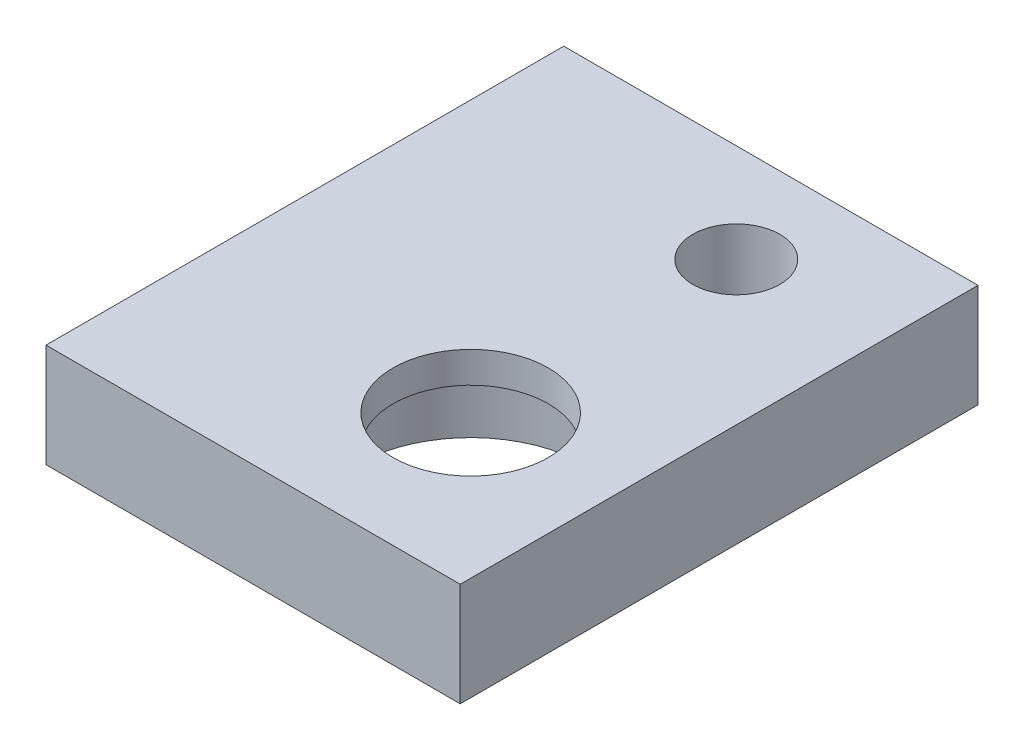
ISO-10303-21;
HEADER;
FILE_DESCRIPTION(('STEP AP214'),'2;1');
FILE_NAME('part.step','',(''),(''),'','','');
FILE_SCHEMA(('AUTOMOTIVE_DESIGN { 1 0 10303 214 1 1 1 1 }'));
ENDSEC;
DATA;
#1=APPLICATION_CONTEXT('core data for automotive mechanical design processes');
#2=APPLICATION_PROTOCOL_DEFINITION('international standard','automotive_design',2000,#1);
#3=PRODUCT_CONTEXT('',#1,'mechanical');
#4=PRODUCT('Part','Part','',(#3));
#5=PRODUCT_RELATED_PRODUCT_CATEGORY('part','',(#4));
#6=PRODUCT_DEFINITION_FORMATION('','',#4);
#7=PRODUCT_DEFINITION_CONTEXT('part definition',#1,'design');
#8=PRODUCT_DEFINITION('design','',#6,#7);
#9=PRODUCT_DEFINITION_SHAPE('','',#8);
#10=(LENGTH_UNIT() NAMED_UNIT(*) SI_UNIT(.MILLI.,.METRE.));
#11=(NAMED_UNIT(*) PLANE_ANGLE_UNIT() SI_UNIT($,.RADIAN.));
#12=(NAMED_UNIT(*) SI_UNIT($,.STERADIAN.) SOLID_ANGLE_UNIT());
#13=UNCERTAINTY_MEASURE_WITH_UNIT(LENGTH_MEASURE(1.E-05),#10,'distance_accuracy_value','');
#14=(GEOMETRIC_REPRESENTATION_CONTEXT(3) GLOBAL_UNCERTAINTY_ASSIGNED_CONTEXT((#13)) GLOBAL_UNIT_ASSIGNED_CONTEXT((#10,
#11,#12)) REPRESENTATION_CONTEXT('',''));
#15=CARTESIAN_POINT('',(0.,0.,0.));
#16=DIRECTION('',(0.,0.,1.));
#17=DIRECTION('',(1.,0.,0.));
#18=AXIS2_PLACEMENT_3D('',#15,#16,#17);
#19=CARTESIAN_POINT('',(0.,10.,0.));
#20=DIRECTION('',(0.,0.,-1.));
#21=DIRECTION('',(-1.,0.,0.));
#22=AXIS2_PLACEMENT_3D('',#19,#20,#21);
#23=PLANE('',#22);
#24=DIRECTION('',(1.,0.,0.));
#25=VECTOR('',#24,1.);
#26=CARTESIAN_POINT('',(0.,0.,0.));
#27=LINE('',#26,#25);
#28=CARTESIAN_POINT('',(0.,0.,0.));
#29=VERTEX_POINT('',#28);
#30=CARTESIAN_POINT('',(40.,0.,0.));
#31=VERTEX_POINT('',#30);
#32=EDGE_CURVE('E101',#29,#31,#27,.T.);
#33=ORIENTED_EDGE('',*,*,#32,.F.);
#34=DIRECTION('',(0.,-1.,0.));
#35=VECTOR('',#34,1.);
#36=CARTESIAN_POINT('',(0.,10.,0.));
#37=LINE('',#36,#35);
#38=CARTESIAN_POINT('',(0.,10.,0.));
#39=VERTEX_POINT('',#38);
#40=EDGE_CURVE('E11',#39,#29,#37,.T.);
#41=ORIENTED_EDGE('',*,*,#40,.F.);
#42=DIRECTION('',(1.,0.,0.));
#43=VECTOR('',#42,1.);
#44=CARTESIAN_POINT('',(0.,10.,0.));
#45=LINE('',#44,#43);
#46=CARTESIAN_POINT('',(40.,10.,0.));
#47=VERTEX_POINT('',#46);
#48=EDGE_CURVE('E95',#39,#47,#45,.T.);
#49=ORIENTED_EDGE('',*,*,#48,.T.);
#50=DIRECTION('',(0.,-1.,0.));
#51=VECTOR('',#50,1.);
#52=CARTESIAN_POINT('',(40.,10.,0.));
#53=LINE('',#52,#51);
#54=EDGE_CURVE('E74',#47,#31,#53,.T.);
#55=ORIENTED_EDGE('',*,*,#54,.T.);
#56=EDGE_LOOP('',(#33,#41,#49,#55));
#57=FACE_BOUND('',#56,.T.);
#58=ADVANCED_FACE('F33',(#57),#23,.T.);
#59=CARTESIAN_POINT('',(0.,10.,0.));
#60=DIRECTION('',(1.,0.,0.));
#61=DIRECTION('',(0.,0.,-1.));
#62=AXIS2_PLACEMENT_3D('',#59,#60,#61);
#63=PLANE('',#62);
#64=DIRECTION('',(0.,0.,1.));
#65=VECTOR('',#64,1.);
#66=CARTESIAN_POINT('',(0.,0.,0.));
#67=LINE('',#66,#65);
#68=CARTESIAN_POINT('',(0.,0.,50.));
#69=VERTEX_POINT('',#68);
#70=EDGE_CURVE('E66',#29,#69,#67,.T.);
#71=ORIENTED_EDGE('',*,*,#70,.T.);
#72=DIRECTION('',(0.,-1.,0.));
#73=VECTOR('',#72,1.);
#74=CARTESIAN_POINT('',(0.,10.,50.));
#75=LINE('',#74,#73);
#76=CARTESIAN_POINT('',(0.,10.,50.));
#77=VERTEX_POINT('',#76);
#78=EDGE_CURVE('E42',#77,#69,#75,.T.);
#79=ORIENTED_EDGE('',*,*,#78,.F.);
#80=DIRECTION('',(0.,0.,1.));
#81=VECTOR('',#80,1.);
#82=CARTESIAN_POINT('',(0.,10.,0.));
#83=LINE('',#82,#81);
#84=EDGE_CURVE('E84',#39,#77,#83,.T.);
#85=ORIENTED_EDGE('',*,*,#84,.F.);
#86=ORIENTED_EDGE('',*,*,#40,.T.);
#87=EDGE_LOOP('',(#71,#79,#85,#86));
#88=FACE_BOUND('',#87,.T.);
#89=ADVANCED_FACE('F128',(#88),#63,.F.);
#90=CARTESIAN_POINT('',(0.,10.,50.));
#91=DIRECTION('',(0.,0.,-1.));
#92=DIRECTION('',(-1.,0.,0.));
#93=AXIS2_PLACEMENT_3D('',#90,#91,#92);
#94=PLANE('',#93);
#95=DIRECTION('',(1.,0.,0.));
#96=VECTOR('',#95,1.);
#97=CARTESIAN_POINT('',(0.,0.,50.));
#98=LINE('',#97,#96);
#99=CARTESIAN_POINT('',(40.,0.,50.));
#100=VERTEX_POINT('',#99);
#101=EDGE_CURVE('E91',#69,#100,#98,.T.);
#102=ORIENTED_EDGE('',*,*,#101,.T.);
#103=DIRECTION('',(0.,-1.,0.));
#104=VECTOR('',#103,1.);
#105=CARTESIAN_POINT('',(40.,10.,50.));
#106=LINE('',#105,#104);
#107=CARTESIAN_POINT('',(40.,10.,50.));
#108=VERTEX_POINT('',#107);
#109=EDGE_CURVE('E88',#108,#100,#106,.T.);
#110=ORIENTED_EDGE('',*,*,#109,.F.);
#111=DIRECTION('',(1.,0.,0.));
#112=VECTOR('',#111,1.);
#113=CARTESIAN_POINT('',(0.,10.,50.));
#114=LINE('',#113,#112);
#115=EDGE_CURVE('E79',#77,#108,#114,.T.);
#116=ORIENTED_EDGE('',*,*,#115,.F.);
#117=ORIENTED_EDGE('',*,*,#78,.T.);
#118=EDGE_LOOP('',(#102,#110,#116,#117));
#119=FACE_BOUND('',#118,.T.);
#120=ADVANCED_FACE('F89',(#119),#94,.F.);
#121=CARTESIAN_POINT('',(40.,10.,0.));
#122=DIRECTION('',(1.,0.,0.));
#123=DIRECTION('',(0.,0.,-1.));
#124=AXIS2_PLACEMENT_3D('',#121,#122,#123);
#125=PLANE('',#124);
#126=DIRECTION('',(0.,0.,1.));
#127=VECTOR('',#126,1.);
#128=CARTESIAN_POINT('',(40.,0.,0.));
#129=LINE('',#128,#127);
#130=EDGE_CURVE('E104',#31,#100,#129,.T.);
#131=ORIENTED_EDGE('',*,*,#130,.F.);
#132=ORIENTED_EDGE('',*,*,#54,.F.);
#133=DIRECTION('',(0.,0.,1.));
#134=VECTOR('',#133,1.);
#135=CARTESIAN_POINT('',(40.,10.,0.));
#136=LINE('',#135,#134);
#137=EDGE_CURVE('E83',#47,#108,#136,.T.);
#138=ORIENTED_EDGE('',*,*,#137,.T.);
#139=ORIENTED_EDGE('',*,*,#109,.T.);
#140=EDGE_LOOP('',(#131,#132,#138,#139));
#141=FACE_BOUND('',#140,.T.);
#142=ADVANCED_FACE('F94',(#141),#125,.T.);
#143=CARTESIAN_POINT('',(0.,10.,0.));
#144=DIRECTION('',(0.,-1.,0.));
#145=DIRECTION('',(0.,0.,-1.));
#146=AXIS2_PLACEMENT_3D('',#143,#144,#145);
#147=PLANE('',#146);
#148=CARTESIAN_POINT('',(26.16,10.,9.5));
#149=DIRECTION('',(0.,-1.,0.));
#150=DIRECTION('',(0.,0.,-1.));
#151=AXIS2_PLACEMENT_3D('',#148,#149,#150);
#152=CIRCLE('',#151,4.2);
#153=CARTESIAN_POINT('',(26.16,10.,5.3));
#154=VERTEX_POINT('',#153);
#155=EDGE_CURVE('E188',#154,#154,#152,.T.);
#156=ORIENTED_EDGE('',*,*,#155,.T.);
#157=EDGE_LOOP('',(#156));
#158=FACE_BOUND('',#157,.T.);
#159=CARTESIAN_POINT('',(26.16,10.,35.15));
#160=DIRECTION('',(0.,-1.,0.));
#161=DIRECTION('',(0.,0.,-1.));
#162=AXIS2_PLACEMENT_3D('',#159,#160,#161);
#163=CIRCLE('',#162,7.5);
#164=CARTESIAN_POINT('',(26.16,10.,27.65));
#165=VERTEX_POINT('',#164);
#166=EDGE_CURVE('E192',#165,#165,#163,.T.);
#167=ORIENTED_EDGE('',*,*,#166,.T.);
#168=EDGE_LOOP('',(#167));
#169=FACE_BOUND('',#168,.T.);
#170=ORIENTED_EDGE('',*,*,#48,.F.);
#171=ORIENTED_EDGE('',*,*,#84,.T.);
#172=ORIENTED_EDGE('',*,*,#115,.T.);
#173=ORIENTED_EDGE('',*,*,#137,.F.);
#174=EDGE_LOOP('',(#170,#171,#172,#173));
#175=FACE_BOUND('',#174,.T.);
#176=ADVANCED_FACE('F82',(#158,#169,#175),#147,.F.);
#177=CARTESIAN_POINT('',(0.,0.,0.));
#178=DIRECTION('',(0.,-1.,0.));
#179=DIRECTION('',(0.,0.,-1.));
#180=AXIS2_PLACEMENT_3D('',#177,#178,#179);
#181=PLANE('',#180);
#182=CARTESIAN_POINT('',(26.16,0.,9.5));
#183=DIRECTION('',(0.,-1.,0.));
#184=DIRECTION('',(0.,0.,-1.));
#185=AXIS2_PLACEMENT_3D('',#182,#183,#184);
#186=CIRCLE('',#185,4.2);
#187=CARTESIAN_POINT('',(26.16,0.,5.3));
#188=VERTEX_POINT('',#187);
#189=EDGE_CURVE('E190',#188,#188,#186,.T.);
#190=ORIENTED_EDGE('',*,*,#189,.F.);
#191=EDGE_LOOP('',(#190));
#192=FACE_BOUND('',#191,.T.);
#193=CARTESIAN_POINT('',(26.16,0.,35.15));
#194=DIRECTION('',(0.,-1.,0.));
#195=DIRECTION('',(0.,0.,-1.));
#196=AXIS2_PLACEMENT_3D('',#193,#194,#195);
#197=CIRCLE('',#196,11.2);
#198=CARTESIAN_POINT('',(26.16,0.,23.95));
#199=VERTEX_POINT('',#198);
#200=EDGE_CURVE('E198',#199,#199,#197,.T.);
#201=ORIENTED_EDGE('',*,*,#200,.F.);
#202=EDGE_LOOP('',(#201));
#203=FACE_BOUND('',#202,.T.);
#204=ORIENTED_EDGE('',*,*,#32,.T.);
#205=ORIENTED_EDGE('',*,*,#130,.T.);
#206=ORIENTED_EDGE('',*,*,#101,.F.);
#207=ORIENTED_EDGE('',*,*,#70,.F.);
#208=EDGE_LOOP('',(#204,#205,#206,#207));
#209=FACE_BOUND('',#208,.T.);
#210=ADVANCED_FACE('F110',(#192,#203,#209),#181,.T.);
#211=CARTESIAN_POINT('',(26.16,7.,35.15));
#212=DIRECTION('',(0.,-1.,0.));
#213=DIRECTION('',(0.,0.,-1.));
#214=AXIS2_PLACEMENT_3D('',#211,#212,#213);
#215=CYLINDRICAL_SURFACE('',#214,11.2);
#216=CARTESIAN_POINT('',(26.16,7.,35.15));
#217=DIRECTION('',(0.,-1.,0.));
#218=DIRECTION('',(0.,0.,-1.));
#219=AXIS2_PLACEMENT_3D('',#216,#217,#218);
#220=CIRCLE('',#219,11.2);
#221=CARTESIAN_POINT('',(26.16,7.,23.95));
#222=VERTEX_POINT('',#221);
#223=EDGE_CURVE('E105',#222,#222,#220,.T.);
#224=ORIENTED_EDGE('',*,*,#223,.F.);
#225=EDGE_LOOP('',(#224));
#226=FACE_BOUND('',#225,.T.);
#227=ORIENTED_EDGE('',*,*,#200,.T.);
#228=EDGE_LOOP('',(#227));
#229=FACE_BOUND('',#228,.T.);
#230=ADVANCED_FACE('F112',(#226,#229),#215,.F.);
#231=CARTESIAN_POINT('',(0.,7.,0.));
#232=DIRECTION('',(0.,-1.,0.));
#233=DIRECTION('',(0.,0.,-1.));
#234=AXIS2_PLACEMENT_3D('',#231,#232,#233);
#235=PLANE('',#234);
#236=CARTESIAN_POINT('',(26.16,7.,35.15));
#237=DIRECTION('',(0.,-1.,0.));
#238=DIRECTION('',(0.,0.,-1.));
#239=AXIS2_PLACEMENT_3D('',#236,#237,#238);
#240=CIRCLE('',#239,7.5);
#241=CARTESIAN_POINT('',(26.16,7.,27.65));
#242=VERTEX_POINT('',#241);
#243=EDGE_CURVE('E36',#242,#242,#240,.T.);
#244=ORIENTED_EDGE('',*,*,#243,.F.);
#245=EDGE_LOOP('',(#244));
#246=FACE_BOUND('',#245,.T.);
#247=ORIENTED_EDGE('',*,*,#223,.T.);
#248=EDGE_LOOP('',(#247));
#249=FACE_BOUND('',#248,.T.);
#250=ADVANCED_FACE('F119',(#246,#249),#235,.T.);
#251=CARTESIAN_POINT('',(26.16,10.,35.15));
#252=DIRECTION('',(0.,-1.,0.));
#253=DIRECTION('',(0.,0.,-1.));
#254=AXIS2_PLACEMENT_3D('',#251,#252,#253);
#255=CYLINDRICAL_SURFACE('',#254,7.5);
#256=ORIENTED_EDGE('',*,*,#243,.T.);
#257=EDGE_LOOP('',(#256));
#258=FACE_BOUND('',#257,.T.);
#259=ORIENTED_EDGE('',*,*,#166,.F.);
#260=EDGE_LOOP('',(#259));
#261=FACE_BOUND('',#260,.T.);
#262=ADVANCED_FACE('F161',(#258,#261),#255,.F.);
#263=CARTESIAN_POINT('',(26.16,10.,9.5));
#264=DIRECTION('',(0.,-1.,0.));
#265=DIRECTION('',(0.,0.,-1.));
#266=AXIS2_PLACEMENT_3D('',#263,#264,#265);
#267=CYLINDRICAL_SURFACE('',#266,4.2);
#268=ORIENTED_EDGE('',*,*,#155,.F.);
#269=EDGE_LOOP('',(#268));
#270=FACE_BOUND('',#269,.T.);
#271=ORIENTED_EDGE('',*,*,#189,.T.);
#272=EDGE_LOOP('',(#271));
#273=FACE_BOUND('',#272,.T.);
#274=ADVANCED_FACE('F171',(#270,#273),#267,.F.);
#275=CLOSED_SHELL('',(#58,#89,#120,#142,#176,#210,#230,#250,#262,#274));
#276=MANIFOLD_SOLID_BREP('B2',#275);
#277=ADVANCED_BREP_SHAPE_REPRESENTATION('',(#18,#276),#14);
#278=SHAPE_DEFINITION_REPRESENTATION(#9,#277);
ENDSEC;
END-ISO-10303-21;
